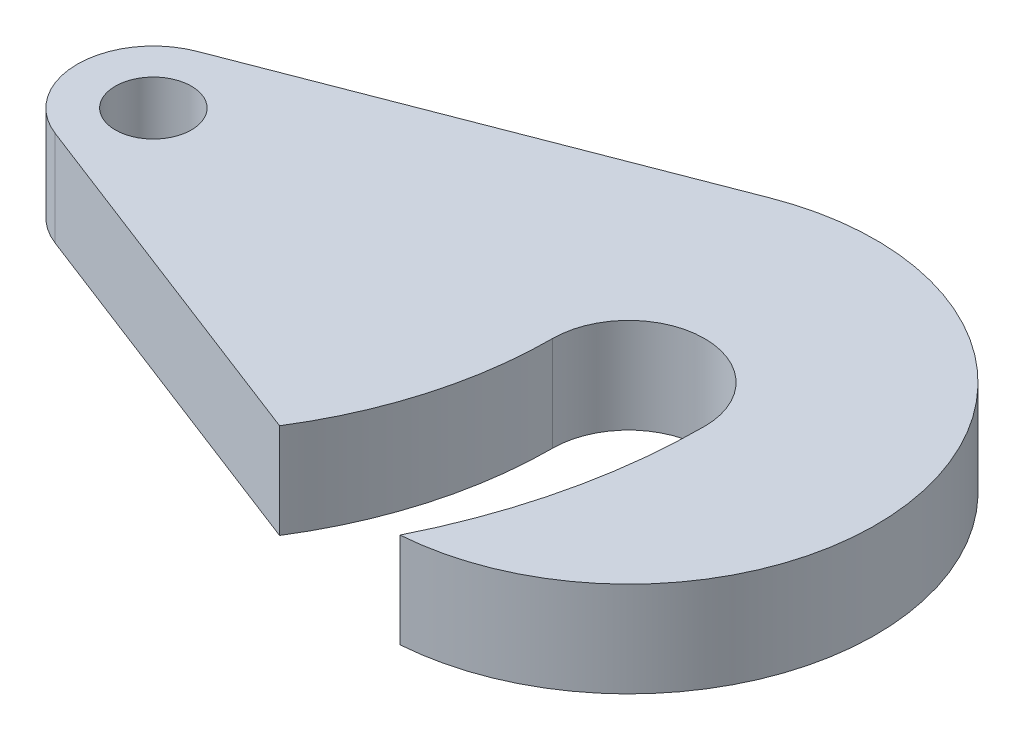
ISO-10303-21;
HEADER;
FILE_DESCRIPTION(('STEP AP214'),'2;1');
FILE_NAME('part.step','',(''),(''),'','','');
FILE_SCHEMA(('AUTOMOTIVE_DESIGN { 1 0 10303 214 1 1 1 1 }'));
ENDSEC;
DATA;
#1=APPLICATION_CONTEXT('core data for automotive mechanical design processes');
#2=APPLICATION_PROTOCOL_DEFINITION('international standard','automotive_design',2000,#1);
#3=PRODUCT_CONTEXT('',#1,'mechanical');
#4=PRODUCT('Part','Part','',(#3));
#5=PRODUCT_RELATED_PRODUCT_CATEGORY('part','',(#4));
#6=PRODUCT_DEFINITION_FORMATION('','',#4);
#7=PRODUCT_DEFINITION_CONTEXT('part definition',#1,'design');
#8=PRODUCT_DEFINITION('design','',#6,#7);
#9=PRODUCT_DEFINITION_SHAPE('','',#8);
#10=(LENGTH_UNIT() NAMED_UNIT(*) SI_UNIT(.MILLI.,.METRE.));
#11=(NAMED_UNIT(*) PLANE_ANGLE_UNIT() SI_UNIT($,.RADIAN.));
#12=(NAMED_UNIT(*) SI_UNIT($,.STERADIAN.) SOLID_ANGLE_UNIT());
#13=UNCERTAINTY_MEASURE_WITH_UNIT(LENGTH_MEASURE(1.E-05),#10,'distance_accuracy_value','');
#14=(GEOMETRIC_REPRESENTATION_CONTEXT(3) GLOBAL_UNCERTAINTY_ASSIGNED_CONTEXT((#13)) GLOBAL_UNIT_ASSIGNED_CONTEXT((#10,
#11,#12)) REPRESENTATION_CONTEXT('',''));
#15=CARTESIAN_POINT('',(0.,0.,0.));
#16=DIRECTION('',(0.,0.,1.));
#17=DIRECTION('',(1.,0.,0.));
#18=AXIS2_PLACEMENT_3D('',#15,#16,#17);
#19=CARTESIAN_POINT('',(50.,10.,0.));
#20=DIRECTION('',(0.,1.,0.));
#21=DIRECTION('',(0.,0.,1.));
#22=AXIS2_PLACEMENT_3D('',#19,#20,#21);
#23=PLANE('',#22);
#24=CARTESIAN_POINT('',(50.,10.,0.));
#25=DIRECTION('',(0.,-1.,0.));
#26=DIRECTION('',(0.,0.,1.));
#27=AXIS2_PLACEMENT_3D('',#24,#25,#26);
#28=CIRCLE('',#27,8.);
#29=CARTESIAN_POINT('',(42.,10.,0.));
#30=VERTEX_POINT('',#29);
#31=CARTESIAN_POINT('',(58.,10.,0.));
#32=VERTEX_POINT('',#31);
#33=EDGE_CURVE('E147',#30,#32,#28,.T.);
#34=ORIENTED_EDGE('',*,*,#33,.T.);
#35=CARTESIAN_POINT('',(0.,10.,0.));
#36=DIRECTION('',(0.,-1.,0.));
#37=DIRECTION('',(0.,0.,1.));
#38=AXIS2_PLACEMENT_3D('',#35,#36,#37);
#39=CIRCLE('',#38,58.);
#40=CARTESIAN_POINT('',(51.88,10.,25.9319416935948));
#41=VERTEX_POINT('',#40);
#42=EDGE_CURVE('E100',#32,#41,#39,.T.);
#43=ORIENTED_EDGE('',*,*,#42,.T.);
#44=CARTESIAN_POINT('',(50.,10.,0.));
#45=DIRECTION('',(0.,1.,0.));
#46=DIRECTION('',(0.,0.,1.));
#47=AXIS2_PLACEMENT_3D('',#44,#45,#46);
#48=CIRCLE('',#47,26.);
#49=CARTESIAN_POINT('',(40.64,10.,-24.2567598825564));
#50=VERTEX_POINT('',#49);
#51=EDGE_CURVE('E159',#41,#50,#48,.T.);
#52=ORIENTED_EDGE('',*,*,#51,.T.);
#53=DIRECTION('',(-0.932952303175248,0.,0.36));
#54=VECTOR('',#53,1.);
#55=CARTESIAN_POINT('',(-2.88,10.,-7.46361842540198));
#56=LINE('',#55,#54);
#57=CARTESIAN_POINT('',(-2.88,10.,-7.46361842540198));
#58=VERTEX_POINT('',#57);
#59=EDGE_CURVE('E116',#50,#58,#56,.T.);
#60=ORIENTED_EDGE('',*,*,#59,.T.);
#61=CARTESIAN_POINT('',(0.,10.,0.));
#62=DIRECTION('',(0.,1.,0.));
#63=DIRECTION('',(0.,0.,1.));
#64=AXIS2_PLACEMENT_3D('',#61,#62,#63);
#65=CIRCLE('',#64,8.);
#66=CARTESIAN_POINT('',(-2.88,10.,7.46361842540198));
#67=VERTEX_POINT('',#66);
#68=EDGE_CURVE('E110',#58,#67,#65,.T.);
#69=ORIENTED_EDGE('',*,*,#68,.T.);
#70=DIRECTION('',(0.932952303175248,0.,0.36));
#71=VECTOR('',#70,1.);
#72=CARTESIAN_POINT('',(-2.88,10.,7.46361842540198));
#73=LINE('',#72,#71);
#74=CARTESIAN_POINT('',(35.5866088965482,10.,22.3067986776256));
#75=VERTEX_POINT('',#74);
#76=EDGE_CURVE('E114',#67,#75,#73,.T.);
#77=ORIENTED_EDGE('',*,*,#76,.T.);
#78=CARTESIAN_POINT('',(0.,10.,0.));
#79=DIRECTION('',(0.,1.,0.));
#80=DIRECTION('',(0.,0.,1.));
#81=AXIS2_PLACEMENT_3D('',#78,#79,#80);
#82=CIRCLE('',#81,42.);
#83=EDGE_CURVE('E60',#75,#30,#82,.T.);
#84=ORIENTED_EDGE('',*,*,#83,.T.);
#85=EDGE_LOOP('',(#34,#43,#52,#60,#69,#77,#84));
#86=FACE_BOUND('',#85,.T.);
#87=CARTESIAN_POINT('',(0.,10.,0.));
#88=DIRECTION('',(0.,1.,0.));
#89=DIRECTION('',(0.,0.,1.));
#90=AXIS2_PLACEMENT_3D('',#87,#88,#89);
#91=CIRCLE('',#90,4.);
#92=CARTESIAN_POINT('',(0.,10.,4.));
#93=VERTEX_POINT('',#92);
#94=EDGE_CURVE('E138',#93,#93,#91,.T.);
#95=ORIENTED_EDGE('',*,*,#94,.F.);
#96=EDGE_LOOP('',(#95));
#97=FACE_BOUND('',#96,.T.);
#98=ADVANCED_FACE('F43',(#86,#97),#23,.T.);
#99=CARTESIAN_POINT('',(50.,0.,0.));
#100=DIRECTION('',(0.,1.,0.));
#101=DIRECTION('',(0.,0.,1.));
#102=AXIS2_PLACEMENT_3D('',#99,#100,#101);
#103=PLANE('',#102);
#104=CARTESIAN_POINT('',(50.,0.,0.));
#105=DIRECTION('',(0.,-1.,0.));
#106=DIRECTION('',(0.,0.,1.));
#107=AXIS2_PLACEMENT_3D('',#104,#105,#106);
#108=CIRCLE('',#107,8.);
#109=CARTESIAN_POINT('',(42.,0.,0.));
#110=VERTEX_POINT('',#109);
#111=CARTESIAN_POINT('',(58.,0.,0.));
#112=VERTEX_POINT('',#111);
#113=EDGE_CURVE('E134',#110,#112,#108,.T.);
#114=ORIENTED_EDGE('',*,*,#113,.F.);
#115=CARTESIAN_POINT('',(0.,0.,0.));
#116=DIRECTION('',(0.,1.,0.));
#117=DIRECTION('',(0.,0.,1.));
#118=AXIS2_PLACEMENT_3D('',#115,#116,#117);
#119=CIRCLE('',#118,42.);
#120=CARTESIAN_POINT('',(35.5866088965482,0.,22.3067986776256));
#121=VERTEX_POINT('',#120);
#122=EDGE_CURVE('E92',#121,#110,#119,.T.);
#123=ORIENTED_EDGE('',*,*,#122,.F.);
#124=DIRECTION('',(0.932952303175248,0.,0.36));
#125=VECTOR('',#124,1.);
#126=CARTESIAN_POINT('',(-2.88,0.,7.46361842540198));
#127=LINE('',#126,#125);
#128=CARTESIAN_POINT('',(-2.88,0.,7.46361842540198));
#129=VERTEX_POINT('',#128);
#130=EDGE_CURVE('E86',#129,#121,#127,.T.);
#131=ORIENTED_EDGE('',*,*,#130,.F.);
#132=CARTESIAN_POINT('',(0.,0.,0.));
#133=DIRECTION('',(0.,1.,0.));
#134=DIRECTION('',(0.,0.,1.));
#135=AXIS2_PLACEMENT_3D('',#132,#133,#134);
#136=CIRCLE('',#135,8.);
#137=CARTESIAN_POINT('',(-2.88,0.,-7.46361842540198));
#138=VERTEX_POINT('',#137);
#139=EDGE_CURVE('E124',#138,#129,#136,.T.);
#140=ORIENTED_EDGE('',*,*,#139,.F.);
#141=DIRECTION('',(-0.932952303175248,0.,0.36));
#142=VECTOR('',#141,1.);
#143=CARTESIAN_POINT('',(-2.88,0.,-7.46361842540198));
#144=LINE('',#143,#142);
#145=CARTESIAN_POINT('',(40.64,0.,-24.2567598825564));
#146=VERTEX_POINT('',#145);
#147=EDGE_CURVE('E142',#146,#138,#144,.T.);
#148=ORIENTED_EDGE('',*,*,#147,.F.);
#149=CARTESIAN_POINT('',(50.,0.,0.));
#150=DIRECTION('',(0.,1.,0.));
#151=DIRECTION('',(0.,0.,1.));
#152=AXIS2_PLACEMENT_3D('',#149,#150,#151);
#153=CIRCLE('',#152,26.);
#154=CARTESIAN_POINT('',(51.88,0.,25.9319416935948));
#155=VERTEX_POINT('',#154);
#156=EDGE_CURVE('E140',#155,#146,#153,.T.);
#157=ORIENTED_EDGE('',*,*,#156,.F.);
#158=CARTESIAN_POINT('',(0.,0.,0.));
#159=DIRECTION('',(0.,-1.,0.));
#160=DIRECTION('',(0.,0.,1.));
#161=AXIS2_PLACEMENT_3D('',#158,#159,#160);
#162=CIRCLE('',#161,58.);
#163=EDGE_CURVE('E137',#112,#155,#162,.T.);
#164=ORIENTED_EDGE('',*,*,#163,.F.);
#165=EDGE_LOOP('',(#114,#123,#131,#140,#148,#157,#164));
#166=FACE_BOUND('',#165,.T.);
#167=CARTESIAN_POINT('',(0.,0.,0.));
#168=DIRECTION('',(0.,1.,0.));
#169=DIRECTION('',(0.,0.,1.));
#170=AXIS2_PLACEMENT_3D('',#167,#168,#169);
#171=CIRCLE('',#170,4.);
#172=CARTESIAN_POINT('',(0.,0.,4.));
#173=VERTEX_POINT('',#172);
#174=EDGE_CURVE('E171',#173,#173,#171,.T.);
#175=ORIENTED_EDGE('',*,*,#174,.T.);
#176=EDGE_LOOP('',(#175));
#177=FACE_BOUND('',#176,.T.);
#178=ADVANCED_FACE('F163',(#166,#177),#103,.F.);
#179=CARTESIAN_POINT('',(50.,10.,0.));
#180=DIRECTION('',(0.,-1.,0.));
#181=DIRECTION('',(0.,0.,-1.));
#182=AXIS2_PLACEMENT_3D('',#179,#180,#181);
#183=CYLINDRICAL_SURFACE('',#182,8.);
#184=ORIENTED_EDGE('',*,*,#113,.T.);
#185=DIRECTION('',(0.,-1.,0.));
#186=VECTOR('',#185,1.);
#187=CARTESIAN_POINT('',(58.,10.,0.));
#188=LINE('',#187,#186);
#189=EDGE_CURVE('E11',#32,#112,#188,.T.);
#190=ORIENTED_EDGE('',*,*,#189,.F.);
#191=ORIENTED_EDGE('',*,*,#33,.F.);
#192=DIRECTION('',(0.,-1.,0.));
#193=VECTOR('',#192,1.);
#194=CARTESIAN_POINT('',(42.,10.,0.));
#195=LINE('',#194,#193);
#196=EDGE_CURVE('E130',#30,#110,#195,.T.);
#197=ORIENTED_EDGE('',*,*,#196,.T.);
#198=EDGE_LOOP('',(#184,#190,#191,#197));
#199=FACE_BOUND('',#198,.T.);
#200=ADVANCED_FACE('F45',(#199),#183,.F.);
#201=CARTESIAN_POINT('',(0.,10.,0.));
#202=DIRECTION('',(0.,-1.,0.));
#203=DIRECTION('',(0.,0.,-1.));
#204=AXIS2_PLACEMENT_3D('',#201,#202,#203);
#205=CYLINDRICAL_SURFACE('',#204,58.);
#206=ORIENTED_EDGE('',*,*,#163,.T.);
#207=DIRECTION('',(0.,-1.,0.));
#208=VECTOR('',#207,1.);
#209=CARTESIAN_POINT('',(51.88,10.,25.9319416935948));
#210=LINE('',#209,#208);
#211=EDGE_CURVE('E52',#41,#155,#210,.T.);
#212=ORIENTED_EDGE('',*,*,#211,.F.);
#213=ORIENTED_EDGE('',*,*,#42,.F.);
#214=ORIENTED_EDGE('',*,*,#189,.T.);
#215=EDGE_LOOP('',(#206,#212,#213,#214));
#216=FACE_BOUND('',#215,.T.);
#217=ADVANCED_FACE('F197',(#216),#205,.F.);
#218=CARTESIAN_POINT('',(50.,10.,0.));
#219=DIRECTION('',(0.,-1.,0.));
#220=DIRECTION('',(0.,0.,-1.));
#221=AXIS2_PLACEMENT_3D('',#218,#219,#220);
#222=CYLINDRICAL_SURFACE('',#221,26.);
#223=ORIENTED_EDGE('',*,*,#156,.T.);
#224=DIRECTION('',(0.,-1.,0.));
#225=VECTOR('',#224,1.);
#226=CARTESIAN_POINT('',(40.64,10.,-24.2567598825564));
#227=LINE('',#226,#225);
#228=EDGE_CURVE('E151',#50,#146,#227,.T.);
#229=ORIENTED_EDGE('',*,*,#228,.F.);
#230=ORIENTED_EDGE('',*,*,#51,.F.);
#231=ORIENTED_EDGE('',*,*,#211,.T.);
#232=EDGE_LOOP('',(#223,#229,#230,#231));
#233=FACE_BOUND('',#232,.T.);
#234=ADVANCED_FACE('F157',(#233),#222,.T.);
#235=CARTESIAN_POINT('',(-2.88,10.,-7.46361842540198));
#236=DIRECTION('',(0.36,0.,0.932952303175248));
#237=DIRECTION('',(0.932952303175248,0.,-0.36));
#238=AXIS2_PLACEMENT_3D('',#235,#236,#237);
#239=PLANE('',#238);
#240=ORIENTED_EDGE('',*,*,#147,.T.);
#241=DIRECTION('',(0.,-1.,0.));
#242=VECTOR('',#241,1.);
#243=CARTESIAN_POINT('',(-2.88,10.,-7.46361842540198));
#244=LINE('',#243,#242);
#245=EDGE_CURVE('E125',#58,#138,#244,.T.);
#246=ORIENTED_EDGE('',*,*,#245,.F.);
#247=ORIENTED_EDGE('',*,*,#59,.F.);
#248=ORIENTED_EDGE('',*,*,#228,.T.);
#249=EDGE_LOOP('',(#240,#246,#247,#248));
#250=FACE_BOUND('',#249,.T.);
#251=ADVANCED_FACE('F166',(#250),#239,.F.);
#252=CARTESIAN_POINT('',(0.,10.,0.));
#253=DIRECTION('',(0.,-1.,0.));
#254=DIRECTION('',(0.,0.,-1.));
#255=AXIS2_PLACEMENT_3D('',#252,#253,#254);
#256=CYLINDRICAL_SURFACE('',#255,8.);
#257=ORIENTED_EDGE('',*,*,#139,.T.);
#258=DIRECTION('',(0.,-1.,0.));
#259=VECTOR('',#258,1.);
#260=CARTESIAN_POINT('',(-2.88,10.,7.46361842540198));
#261=LINE('',#260,#259);
#262=EDGE_CURVE('E121',#67,#129,#261,.T.);
#263=ORIENTED_EDGE('',*,*,#262,.F.);
#264=ORIENTED_EDGE('',*,*,#68,.F.);
#265=ORIENTED_EDGE('',*,*,#245,.T.);
#266=EDGE_LOOP('',(#257,#263,#264,#265));
#267=FACE_BOUND('',#266,.T.);
#268=ADVANCED_FACE('F122',(#267),#256,.T.);
#269=CARTESIAN_POINT('',(-2.88,10.,7.46361842540198));
#270=DIRECTION('',(0.36,0.,-0.932952303175248));
#271=DIRECTION('',(-0.932952303175248,0.,-0.36));
#272=AXIS2_PLACEMENT_3D('',#269,#270,#271);
#273=PLANE('',#272);
#274=ORIENTED_EDGE('',*,*,#130,.T.);
#275=DIRECTION('',(0.,-1.,0.));
#276=VECTOR('',#275,1.);
#277=CARTESIAN_POINT('',(35.5866088965482,10.,22.3067986776256));
#278=LINE('',#277,#276);
#279=EDGE_CURVE('E126',#75,#121,#278,.T.);
#280=ORIENTED_EDGE('',*,*,#279,.F.);
#281=ORIENTED_EDGE('',*,*,#76,.F.);
#282=ORIENTED_EDGE('',*,*,#262,.T.);
#283=EDGE_LOOP('',(#274,#280,#281,#282));
#284=FACE_BOUND('',#283,.T.);
#285=ADVANCED_FACE('F128',(#284),#273,.F.);
#286=CARTESIAN_POINT('',(0.,10.,0.));
#287=DIRECTION('',(0.,-1.,0.));
#288=DIRECTION('',(0.,0.,-1.));
#289=AXIS2_PLACEMENT_3D('',#286,#287,#288);
#290=CYLINDRICAL_SURFACE('',#289,42.);
#291=ORIENTED_EDGE('',*,*,#122,.T.);
#292=ORIENTED_EDGE('',*,*,#196,.F.);
#293=ORIENTED_EDGE('',*,*,#83,.F.);
#294=ORIENTED_EDGE('',*,*,#279,.T.);
#295=EDGE_LOOP('',(#291,#292,#293,#294));
#296=FACE_BOUND('',#295,.T.);
#297=ADVANCED_FACE('F187',(#296),#290,.T.);
#298=CARTESIAN_POINT('',(0.,10.,0.));
#299=DIRECTION('',(0.,-1.,0.));
#300=DIRECTION('',(0.,0.,-1.));
#301=AXIS2_PLACEMENT_3D('',#298,#299,#300);
#302=CYLINDRICAL_SURFACE('',#301,4.);
#303=ORIENTED_EDGE('',*,*,#94,.T.);
#304=EDGE_LOOP('',(#303));
#305=FACE_BOUND('',#304,.T.);
#306=ORIENTED_EDGE('',*,*,#174,.F.);
#307=EDGE_LOOP('',(#306));
#308=FACE_BOUND('',#307,.T.);
#309=ADVANCED_FACE('F177',(#305,#308),#302,.F.);
#310=CLOSED_SHELL('',(#98,#178,#200,#217,#234,#251,#268,#285,#297,#309));
#311=MANIFOLD_SOLID_BREP('B2',#310);
#312=ADVANCED_BREP_SHAPE_REPRESENTATION('',(#18,#311),#14);
#313=SHAPE_DEFINITION_REPRESENTATION(#9,#312);
ENDSEC;
END-ISO-10303-21;
